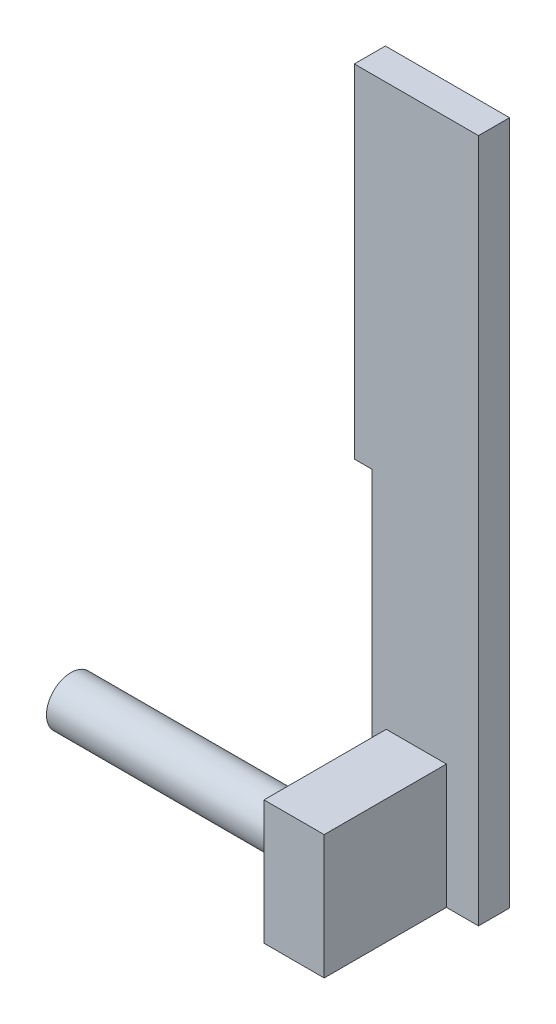
ISO-10303-21;
HEADER;
FILE_DESCRIPTION(('STEP AP214'),'2;1');
FILE_NAME('part.step','',(''),(''),'','','');
FILE_SCHEMA(('AUTOMOTIVE_DESIGN { 1 0 10303 214 1 1 1 1 }'));
ENDSEC;
DATA;
#1=APPLICATION_CONTEXT('core data for automotive mechanical design processes');
#2=APPLICATION_PROTOCOL_DEFINITION('international standard','automotive_design',2000,#1);
#3=PRODUCT_CONTEXT('',#1,'mechanical');
#4=PRODUCT('Part','Part','',(#3));
#5=PRODUCT_RELATED_PRODUCT_CATEGORY('part','',(#4));
#6=PRODUCT_DEFINITION_FORMATION('','',#4);
#7=PRODUCT_DEFINITION_CONTEXT('part definition',#1,'design');
#8=PRODUCT_DEFINITION('design','',#6,#7);
#9=PRODUCT_DEFINITION_SHAPE('','',#8);
#10=(LENGTH_UNIT() NAMED_UNIT(*) SI_UNIT(.MILLI.,.METRE.));
#11=(NAMED_UNIT(*) PLANE_ANGLE_UNIT() SI_UNIT($,.RADIAN.));
#12=(NAMED_UNIT(*) SI_UNIT($,.STERADIAN.) SOLID_ANGLE_UNIT());
#13=UNCERTAINTY_MEASURE_WITH_UNIT(LENGTH_MEASURE(1.E-05),#10,'distance_accuracy_value','');
#14=(GEOMETRIC_REPRESENTATION_CONTEXT(3) GLOBAL_UNCERTAINTY_ASSIGNED_CONTEXT((#13)) GLOBAL_UNIT_ASSIGNED_CONTEXT((#10,
#11,#12)) REPRESENTATION_CONTEXT('',''));
#15=CARTESIAN_POINT('',(0.,0.,0.));
#16=DIRECTION('',(0.,0.,1.));
#17=DIRECTION('',(1.,0.,0.));
#18=AXIS2_PLACEMENT_3D('',#15,#16,#17);
#19=CARTESIAN_POINT('',(-25.4,-140.,12.7));
#20=DIRECTION('',(1.,0.,0.));
#21=DIRECTION('',(0.,0.,-1.));
#22=AXIS2_PLACEMENT_3D('',#19,#20,#21);
#23=PLANE('',#22);
#24=DIRECTION('',(0.,-1.,0.));
#25=VECTOR('',#24,1.);
#26=CARTESIAN_POINT('',(-25.4,-140.,0.));
#27=LINE('',#26,#25);
#28=CARTESIAN_POINT('',(-25.4,140.,0.));
#29=VERTEX_POINT('',#28);
#30=CARTESIAN_POINT('',(-25.4,0.,0.));
#31=VERTEX_POINT('',#30);
#32=EDGE_CURVE('E132',#29,#31,#27,.T.);
#33=ORIENTED_EDGE('',*,*,#32,.T.);
#34=DIRECTION('',(0.,0.,1.));
#35=VECTOR('',#34,1.);
#36=CARTESIAN_POINT('',(-25.4,0.,0.));
#37=LINE('',#36,#35);
#38=CARTESIAN_POINT('',(-25.4,0.,12.7));
#39=VERTEX_POINT('',#38);
#40=EDGE_CURVE('E187',#31,#39,#37,.T.);
#41=ORIENTED_EDGE('',*,*,#40,.T.);
#42=DIRECTION('',(0.,-1.,0.));
#43=VECTOR('',#42,1.);
#44=CARTESIAN_POINT('',(-25.4,-140.,12.7));
#45=LINE('',#44,#43);
#46=CARTESIAN_POINT('',(-25.4,140.,12.7));
#47=VERTEX_POINT('',#46);
#48=EDGE_CURVE('E142',#47,#39,#45,.T.);
#49=ORIENTED_EDGE('',*,*,#48,.F.);
#50=DIRECTION('',(0.,0.,-1.));
#51=VECTOR('',#50,1.);
#52=CARTESIAN_POINT('',(-25.4,140.,12.7));
#53=LINE('',#52,#51);
#54=EDGE_CURVE('E143',#47,#29,#53,.T.);
#55=ORIENTED_EDGE('',*,*,#54,.T.);
#56=EDGE_LOOP('',(#33,#41,#49,#55));
#57=FACE_BOUND('',#56,.T.);
#58=ADVANCED_FACE('F33',(#57),#23,.F.);
#59=CARTESIAN_POINT('',(25.4,-140.,12.7));
#60=DIRECTION('',(0.,1.,0.));
#61=DIRECTION('',(0.,0.,1.));
#62=AXIS2_PLACEMENT_3D('',#59,#60,#61);
#63=PLANE('',#62);
#64=DIRECTION('',(1.,0.,0.));
#65=VECTOR('',#64,1.);
#66=CARTESIAN_POINT('',(25.4,-140.,12.7));
#67=LINE('',#66,#65);
#68=CARTESIAN_POINT('',(-18.0891060343374,-140.,12.7));
#69=VERTEX_POINT('',#68);
#70=CARTESIAN_POINT('',(-12.3367641270537,-140.,12.7));
#71=VERTEX_POINT('',#70);
#72=EDGE_CURVE('E126',#69,#71,#67,.T.);
#73=ORIENTED_EDGE('',*,*,#72,.F.);
#74=DIRECTION('',(0.,0.,1.));
#75=VECTOR('',#74,1.);
#76=CARTESIAN_POINT('',(-18.0891060343374,-140.,0.));
#77=LINE('',#76,#75);
#78=CARTESIAN_POINT('',(-18.0891060343374,-140.,0.));
#79=VERTEX_POINT('',#78);
#80=EDGE_CURVE('E112',#79,#69,#77,.T.);
#81=ORIENTED_EDGE('',*,*,#80,.F.);
#82=DIRECTION('',(1.,0.,0.));
#83=VECTOR('',#82,1.);
#84=CARTESIAN_POINT('',(25.4,-140.,0.));
#85=LINE('',#84,#83);
#86=CARTESIAN_POINT('',(25.4,-140.,0.));
#87=VERTEX_POINT('',#86);
#88=EDGE_CURVE('E123',#79,#87,#85,.T.);
#89=ORIENTED_EDGE('',*,*,#88,.T.);
#90=DIRECTION('',(0.,0.,-1.));
#91=VECTOR('',#90,1.);
#92=CARTESIAN_POINT('',(25.4,-140.,12.7));
#93=LINE('',#92,#91);
#94=CARTESIAN_POINT('',(25.4,-140.,12.7));
#95=VERTEX_POINT('',#94);
#96=EDGE_CURVE('E40',#95,#87,#93,.T.);
#97=ORIENTED_EDGE('',*,*,#96,.F.);
#98=CARTESIAN_POINT('',(12.273622765,-140.,12.7));
#99=VERTEX_POINT('',#98);
#100=EDGE_CURVE('E156',#99,#95,#67,.T.);
#101=ORIENTED_EDGE('',*,*,#100,.F.);
#102=DIRECTION('',(0.,0.,-1.));
#103=VECTOR('',#102,1.);
#104=CARTESIAN_POINT('',(12.273622765,-140.,62.7));
#105=LINE('',#104,#103);
#106=CARTESIAN_POINT('',(12.273622765,-140.,62.7));
#107=VERTEX_POINT('',#106);
#108=EDGE_CURVE('E158',#107,#99,#105,.T.);
#109=ORIENTED_EDGE('',*,*,#108,.F.);
#110=DIRECTION('',(1.,0.,0.));
#111=VECTOR('',#110,1.);
#112=CARTESIAN_POINT('',(-12.3367641270537,-140.,62.7));
#113=LINE('',#112,#111);
#114=CARTESIAN_POINT('',(-12.3367641270537,-140.,62.7));
#115=VERTEX_POINT('',#114);
#116=EDGE_CURVE('E199',#115,#107,#113,.T.);
#117=ORIENTED_EDGE('',*,*,#116,.F.);
#118=DIRECTION('',(0.,0.,-1.));
#119=VECTOR('',#118,1.);
#120=CARTESIAN_POINT('',(-12.3367641270537,-140.,62.7));
#121=LINE('',#120,#119);
#122=EDGE_CURVE('E137',#115,#71,#121,.T.);
#123=ORIENTED_EDGE('',*,*,#122,.T.);
#124=EDGE_LOOP('',(#73,#81,#89,#97,#101,#109,#117,#123));
#125=FACE_BOUND('',#124,.T.);
#126=ADVANCED_FACE('F121',(#125),#63,.F.);
#127=CARTESIAN_POINT('',(25.4,-140.,12.7));
#128=DIRECTION('',(-1.,0.,0.));
#129=DIRECTION('',(0.,0.,1.));
#130=AXIS2_PLACEMENT_3D('',#127,#128,#129);
#131=PLANE('',#130);
#132=DIRECTION('',(0.,1.,0.));
#133=VECTOR('',#132,1.);
#134=CARTESIAN_POINT('',(25.4,-140.,0.));
#135=LINE('',#134,#133);
#136=CARTESIAN_POINT('',(25.4,140.,0.));
#137=VERTEX_POINT('',#136);
#138=EDGE_CURVE('E131',#87,#137,#135,.T.);
#139=ORIENTED_EDGE('',*,*,#138,.T.);
#140=DIRECTION('',(0.,0.,-1.));
#141=VECTOR('',#140,1.);
#142=CARTESIAN_POINT('',(25.4,140.,12.7));
#143=LINE('',#142,#141);
#144=CARTESIAN_POINT('',(25.4,140.,12.7));
#145=VERTEX_POINT('',#144);
#146=EDGE_CURVE('E146',#145,#137,#143,.T.);
#147=ORIENTED_EDGE('',*,*,#146,.F.);
#148=DIRECTION('',(0.,1.,0.));
#149=VECTOR('',#148,1.);
#150=CARTESIAN_POINT('',(25.4,-140.,12.7));
#151=LINE('',#150,#149);
#152=EDGE_CURVE('E153',#95,#145,#151,.T.);
#153=ORIENTED_EDGE('',*,*,#152,.F.);
#154=ORIENTED_EDGE('',*,*,#96,.T.);
#155=EDGE_LOOP('',(#139,#147,#153,#154));
#156=FACE_BOUND('',#155,.T.);
#157=ADVANCED_FACE('F151',(#156),#131,.F.);
#158=CARTESIAN_POINT('',(25.4,140.,12.7));
#159=DIRECTION('',(0.,-1.,0.));
#160=DIRECTION('',(0.,0.,-1.));
#161=AXIS2_PLACEMENT_3D('',#158,#159,#160);
#162=PLANE('',#161);
#163=DIRECTION('',(-1.,0.,0.));
#164=VECTOR('',#163,1.);
#165=CARTESIAN_POINT('',(25.4,140.,0.));
#166=LINE('',#165,#164);
#167=EDGE_CURVE('E134',#137,#29,#166,.T.);
#168=ORIENTED_EDGE('',*,*,#167,.T.);
#169=ORIENTED_EDGE('',*,*,#54,.F.);
#170=DIRECTION('',(-1.,0.,0.));
#171=VECTOR('',#170,1.);
#172=CARTESIAN_POINT('',(25.4,140.,12.7));
#173=LINE('',#172,#171);
#174=EDGE_CURVE('E147',#145,#47,#173,.T.);
#175=ORIENTED_EDGE('',*,*,#174,.F.);
#176=ORIENTED_EDGE('',*,*,#146,.T.);
#177=EDGE_LOOP('',(#168,#169,#175,#176));
#178=FACE_BOUND('',#177,.T.);
#179=ADVANCED_FACE('F183',(#178),#162,.F.);
#180=CARTESIAN_POINT('',(0.,0.,12.7));
#181=DIRECTION('',(0.,0.,1.));
#182=DIRECTION('',(1.,0.,0.));
#183=AXIS2_PLACEMENT_3D('',#180,#181,#182);
#184=PLANE('',#183);
#185=DIRECTION('',(-1.,0.,0.));
#186=VECTOR('',#185,1.);
#187=CARTESIAN_POINT('',(-25.4,0.,12.7));
#188=LINE('',#187,#186);
#189=CARTESIAN_POINT('',(-18.0891060343374,0.,12.7));
#190=VERTEX_POINT('',#189);
#191=EDGE_CURVE('E117',#190,#39,#188,.T.);
#192=ORIENTED_EDGE('',*,*,#191,.F.);
#193=DIRECTION('',(0.,1.,0.));
#194=VECTOR('',#193,1.);
#195=CARTESIAN_POINT('',(-18.0891060343374,-140.,12.7));
#196=LINE('',#195,#194);
#197=EDGE_CURVE('E335',#69,#190,#196,.T.);
#198=ORIENTED_EDGE('',*,*,#197,.F.);
#199=ORIENTED_EDGE('',*,*,#72,.T.);
#200=DIRECTION('',(0.,-1.,0.));
#201=VECTOR('',#200,1.);
#202=CARTESIAN_POINT('',(-12.3367641270537,-140.,12.7));
#203=LINE('',#202,#201);
#204=CARTESIAN_POINT('',(-12.3367641270537,-89.2,12.7));
#205=VERTEX_POINT('',#204);
#206=EDGE_CURVE('E55',#205,#71,#203,.T.);
#207=ORIENTED_EDGE('',*,*,#206,.F.);
#208=DIRECTION('',(-1.,0.,0.));
#209=VECTOR('',#208,1.);
#210=CARTESIAN_POINT('',(-12.3367641270537,-89.2,12.7));
#211=LINE('',#210,#209);
#212=CARTESIAN_POINT('',(12.273622765,-89.2,12.7));
#213=VERTEX_POINT('',#212);
#214=EDGE_CURVE('E200',#213,#205,#211,.T.);
#215=ORIENTED_EDGE('',*,*,#214,.F.);
#216=DIRECTION('',(0.,1.,0.));
#217=VECTOR('',#216,1.);
#218=CARTESIAN_POINT('',(12.273622765,-140.,12.7));
#219=LINE('',#218,#217);
#220=EDGE_CURVE('E165',#99,#213,#219,.T.);
#221=ORIENTED_EDGE('',*,*,#220,.F.);
#222=ORIENTED_EDGE('',*,*,#100,.T.);
#223=ORIENTED_EDGE('',*,*,#152,.T.);
#224=ORIENTED_EDGE('',*,*,#174,.T.);
#225=ORIENTED_EDGE('',*,*,#48,.T.);
#226=EDGE_LOOP('',(#192,#198,#199,#207,#215,#221,#222,#223,#224,#225));
#227=FACE_BOUND('',#226,.T.);
#228=ADVANCED_FACE('F180',(#227),#184,.T.);
#229=CARTESIAN_POINT('',(0.,0.,0.));
#230=DIRECTION('',(0.,0.,1.));
#231=DIRECTION('',(1.,0.,0.));
#232=AXIS2_PLACEMENT_3D('',#229,#230,#231);
#233=PLANE('',#232);
#234=DIRECTION('',(0.,1.,0.));
#235=VECTOR('',#234,1.);
#236=CARTESIAN_POINT('',(-18.0891060343374,-140.,0.));
#237=LINE('',#236,#235);
#238=CARTESIAN_POINT('',(-18.0891060343374,0.,0.));
#239=VERTEX_POINT('',#238);
#240=EDGE_CURVE('E108',#79,#239,#237,.T.);
#241=ORIENTED_EDGE('',*,*,#240,.T.);
#242=DIRECTION('',(-1.,0.,0.));
#243=VECTOR('',#242,1.);
#244=CARTESIAN_POINT('',(-25.4,0.,0.));
#245=LINE('',#244,#243);
#246=EDGE_CURVE('E47',#239,#31,#245,.T.);
#247=ORIENTED_EDGE('',*,*,#246,.T.);
#248=ORIENTED_EDGE('',*,*,#32,.F.);
#249=ORIENTED_EDGE('',*,*,#167,.F.);
#250=ORIENTED_EDGE('',*,*,#138,.F.);
#251=ORIENTED_EDGE('',*,*,#88,.F.);
#252=EDGE_LOOP('',(#241,#247,#248,#249,#250,#251));
#253=FACE_BOUND('',#252,.T.);
#254=ADVANCED_FACE('F129',(#253),#233,.F.);
#255=CARTESIAN_POINT('',(-12.3367641270537,-140.,62.7));
#256=DIRECTION('',(1.,0.,0.));
#257=DIRECTION('',(0.,0.,-1.));
#258=AXIS2_PLACEMENT_3D('',#255,#256,#257);
#259=PLANE('',#258);
#260=CARTESIAN_POINT('',(-12.3367641270537,-114.6,41.7));
#261=DIRECTION('',(1.,0.,0.));
#262=DIRECTION('',(0.,0.,-1.));
#263=AXIS2_PLACEMENT_3D('',#260,#261,#262);
#264=CIRCLE('',#263,10.0118893781049);
#265=CARTESIAN_POINT('',(-12.3367641270537,-114.6,31.6881106218951));
#266=VERTEX_POINT('',#265);
#267=EDGE_CURVE('E11',#266,#266,#264,.F.);
#268=ORIENTED_EDGE('',*,*,#267,.F.);
#269=EDGE_LOOP('',(#268));
#270=FACE_BOUND('',#269,.T.);
#271=ORIENTED_EDGE('',*,*,#206,.T.);
#272=ORIENTED_EDGE('',*,*,#122,.F.);
#273=DIRECTION('',(0.,-1.,0.));
#274=VECTOR('',#273,1.);
#275=CARTESIAN_POINT('',(-12.3367641270537,-140.,62.7));
#276=LINE('',#275,#274);
#277=CARTESIAN_POINT('',(-12.3367641270537,-89.2,62.7));
#278=VERTEX_POINT('',#277);
#279=EDGE_CURVE('E196',#278,#115,#276,.T.);
#280=ORIENTED_EDGE('',*,*,#279,.F.);
#281=DIRECTION('',(0.,0.,-1.));
#282=VECTOR('',#281,1.);
#283=CARTESIAN_POINT('',(-12.3367641270537,-89.2,62.7));
#284=LINE('',#283,#282);
#285=EDGE_CURVE('E171',#278,#205,#284,.T.);
#286=ORIENTED_EDGE('',*,*,#285,.T.);
#287=EDGE_LOOP('',(#271,#272,#280,#286));
#288=FACE_BOUND('',#287,.T.);
#289=ADVANCED_FACE('F211',(#270,#288),#259,.F.);
#290=CARTESIAN_POINT('',(12.273622765,-140.,62.7));
#291=DIRECTION('',(-1.,0.,0.));
#292=DIRECTION('',(0.,0.,1.));
#293=AXIS2_PLACEMENT_3D('',#290,#291,#292);
#294=PLANE('',#293);
#295=ORIENTED_EDGE('',*,*,#220,.T.);
#296=DIRECTION('',(0.,0.,-1.));
#297=VECTOR('',#296,1.);
#298=CARTESIAN_POINT('',(12.273622765,-89.2,62.7));
#299=LINE('',#298,#297);
#300=CARTESIAN_POINT('',(12.273622765,-89.2,62.7));
#301=VERTEX_POINT('',#300);
#302=EDGE_CURVE('E168',#301,#213,#299,.T.);
#303=ORIENTED_EDGE('',*,*,#302,.F.);
#304=DIRECTION('',(0.,1.,0.));
#305=VECTOR('',#304,1.);
#306=CARTESIAN_POINT('',(12.273622765,-140.,62.7));
#307=LINE('',#306,#305);
#308=EDGE_CURVE('E167',#107,#301,#307,.T.);
#309=ORIENTED_EDGE('',*,*,#308,.F.);
#310=ORIENTED_EDGE('',*,*,#108,.T.);
#311=EDGE_LOOP('',(#295,#303,#309,#310));
#312=FACE_BOUND('',#311,.T.);
#313=ADVANCED_FACE('F163',(#312),#294,.F.);
#314=CARTESIAN_POINT('',(-12.3367641270537,-89.2,62.7));
#315=DIRECTION('',(0.,-1.,0.));
#316=DIRECTION('',(0.,0.,-1.));
#317=AXIS2_PLACEMENT_3D('',#314,#315,#316);
#318=PLANE('',#317);
#319=ORIENTED_EDGE('',*,*,#214,.T.);
#320=ORIENTED_EDGE('',*,*,#285,.F.);
#321=DIRECTION('',(-1.,0.,0.));
#322=VECTOR('',#321,1.);
#323=CARTESIAN_POINT('',(-12.3367641270537,-89.2,62.7));
#324=LINE('',#323,#322);
#325=EDGE_CURVE('E203',#301,#278,#324,.T.);
#326=ORIENTED_EDGE('',*,*,#325,.F.);
#327=ORIENTED_EDGE('',*,*,#302,.T.);
#328=EDGE_LOOP('',(#319,#320,#326,#327));
#329=FACE_BOUND('',#328,.T.);
#330=ADVANCED_FACE('F215',(#329),#318,.F.);
#331=CARTESIAN_POINT('',(0.,0.,62.7));
#332=DIRECTION('',(0.,0.,-1.));
#333=DIRECTION('',(-1.,0.,0.));
#334=AXIS2_PLACEMENT_3D('',#331,#332,#333);
#335=PLANE('',#334);
#336=ORIENTED_EDGE('',*,*,#279,.T.);
#337=ORIENTED_EDGE('',*,*,#116,.T.);
#338=ORIENTED_EDGE('',*,*,#308,.T.);
#339=ORIENTED_EDGE('',*,*,#325,.T.);
#340=EDGE_LOOP('',(#336,#337,#338,#339));
#341=FACE_BOUND('',#340,.T.);
#342=ADVANCED_FACE('F217',(#341),#335,.F.);
#343=CARTESIAN_POINT('',(-112.336764127054,-114.6,41.7));
#344=DIRECTION('',(1.,0.,0.));
#345=DIRECTION('',(0.,0.,-1.));
#346=AXIS2_PLACEMENT_3D('',#343,#344,#345);
#347=CYLINDRICAL_SURFACE('',#346,10.0118893781049);
#348=CARTESIAN_POINT('',(-112.336764127054,-114.6,41.7));
#349=DIRECTION('',(-1.,0.,0.));
#350=DIRECTION('',(0.,0.,1.));
#351=AXIS2_PLACEMENT_3D('',#348,#349,#350);
#352=CIRCLE('',#351,10.0118893781049);
#353=CARTESIAN_POINT('',(-112.336764127054,-114.6,51.7118893781049));
#354=VERTEX_POINT('',#353);
#355=EDGE_CURVE('E188',#354,#354,#352,.T.);
#356=ORIENTED_EDGE('',*,*,#355,.F.);
#357=EDGE_LOOP('',(#356));
#358=FACE_BOUND('',#357,.T.);
#359=ORIENTED_EDGE('',*,*,#267,.T.);
#360=EDGE_LOOP('',(#359));
#361=FACE_BOUND('',#360,.T.);
#362=ADVANCED_FACE('F219',(#358,#361),#347,.T.);
#363=CARTESIAN_POINT('',(-112.336764127054,-114.6,41.7));
#364=DIRECTION('',(-1.,0.,0.));
#365=DIRECTION('',(0.,0.,1.));
#366=AXIS2_PLACEMENT_3D('',#363,#364,#365);
#367=PLANE('',#366);
#368=ORIENTED_EDGE('',*,*,#355,.T.);
#369=EDGE_LOOP('',(#368));
#370=FACE_BOUND('',#369,.T.);
#371=ADVANCED_FACE('F225',(#370),#367,.T.);
#372=CARTESIAN_POINT('',(-25.4,0.,0.));
#373=DIRECTION('',(0.,1.,0.));
#374=DIRECTION('',(0.,0.,1.));
#375=AXIS2_PLACEMENT_3D('',#372,#373,#374);
#376=PLANE('',#375);
#377=ORIENTED_EDGE('',*,*,#191,.T.);
#378=ORIENTED_EDGE('',*,*,#40,.F.);
#379=ORIENTED_EDGE('',*,*,#246,.F.);
#380=DIRECTION('',(0.,0.,1.));
#381=VECTOR('',#380,1.);
#382=CARTESIAN_POINT('',(-18.0891060343374,0.,0.));
#383=LINE('',#382,#381);
#384=EDGE_CURVE('E114',#239,#190,#383,.T.);
#385=ORIENTED_EDGE('',*,*,#384,.T.);
#386=EDGE_LOOP('',(#377,#378,#379,#385));
#387=FACE_BOUND('',#386,.T.);
#388=ADVANCED_FACE('F281',(#387),#376,.F.);
#389=CARTESIAN_POINT('',(-18.0891060343374,-140.,0.));
#390=DIRECTION('',(1.,0.,0.));
#391=DIRECTION('',(0.,0.,-1.));
#392=AXIS2_PLACEMENT_3D('',#389,#390,#391);
#393=PLANE('',#392);
#394=ORIENTED_EDGE('',*,*,#197,.T.);
#395=ORIENTED_EDGE('',*,*,#384,.F.);
#396=ORIENTED_EDGE('',*,*,#240,.F.);
#397=ORIENTED_EDGE('',*,*,#80,.T.);
#398=EDGE_LOOP('',(#394,#395,#396,#397));
#399=FACE_BOUND('',#398,.T.);
#400=ADVANCED_FACE('F111',(#399),#393,.F.);
#401=CLOSED_SHELL('',(#58,#126,#157,#179,#228,#254,#289,#313,#330,#342,#362,#371,#388,#400));
#402=MANIFOLD_SOLID_BREP('B2',#401);
#403=ADVANCED_BREP_SHAPE_REPRESENTATION('',(#18,#402),#14);
#404=SHAPE_DEFINITION_REPRESENTATION(#9,#403);
ENDSEC;
END-ISO-10303-21;
